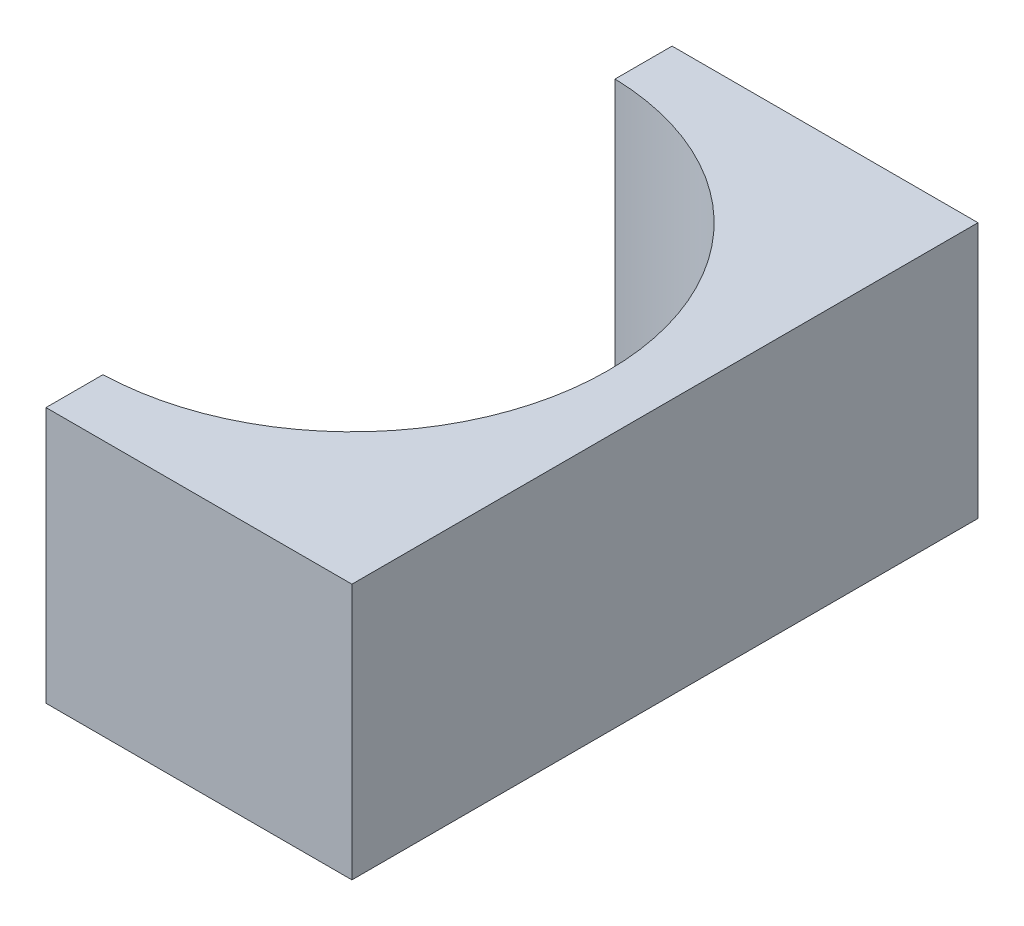
ISO-10303-21;
HEADER;
FILE_DESCRIPTION(('STEP AP214'),'2;1');
FILE_NAME('part.step','',(''),(''),'','','');
FILE_SCHEMA(('AUTOMOTIVE_DESIGN { 1 0 10303 214 1 1 1 1 }'));
ENDSEC;
DATA;
#1=APPLICATION_CONTEXT('core data for automotive mechanical design processes');
#2=APPLICATION_PROTOCOL_DEFINITION('international standard','automotive_design',2000,#1);
#3=PRODUCT_CONTEXT('',#1,'mechanical');
#4=PRODUCT('Part','Part','',(#3));
#5=PRODUCT_RELATED_PRODUCT_CATEGORY('part','',(#4));
#6=PRODUCT_DEFINITION_FORMATION('','',#4);
#7=PRODUCT_DEFINITION_CONTEXT('part definition',#1,'design');
#8=PRODUCT_DEFINITION('design','',#6,#7);
#9=PRODUCT_DEFINITION_SHAPE('','',#8);
#10=(LENGTH_UNIT() NAMED_UNIT(*) SI_UNIT(.MILLI.,.METRE.));
#11=(NAMED_UNIT(*) PLANE_ANGLE_UNIT() SI_UNIT($,.RADIAN.));
#12=(NAMED_UNIT(*) SI_UNIT($,.STERADIAN.) SOLID_ANGLE_UNIT());
#13=UNCERTAINTY_MEASURE_WITH_UNIT(LENGTH_MEASURE(1.E-05),#10,'distance_accuracy_value','');
#14=(GEOMETRIC_REPRESENTATION_CONTEXT(3) GLOBAL_UNCERTAINTY_ASSIGNED_CONTEXT((#13)) GLOBAL_UNIT_ASSIGNED_CONTEXT((#10,
#11,#12)) REPRESENTATION_CONTEXT('',''));
#15=CARTESIAN_POINT('',(0.,0.,0.));
#16=DIRECTION('',(0.,0.,1.));
#17=DIRECTION('',(1.,0.,0.));
#18=AXIS2_PLACEMENT_3D('',#15,#16,#17);
#19=CARTESIAN_POINT('',(0.,22.86,0.));
#20=DIRECTION('',(1.,0.,0.));
#21=DIRECTION('',(0.,0.,-1.));
#22=AXIS2_PLACEMENT_3D('',#19,#20,#21);
#23=PLANE('',#22);
#24=DIRECTION('',(0.,0.,1.));
#25=VECTOR('',#24,1.);
#26=CARTESIAN_POINT('',(0.,0.,0.));
#27=LINE('',#26,#25);
#28=CARTESIAN_POINT('',(0.,0.,-5.08882114638284));
#29=VERTEX_POINT('',#28);
#30=CARTESIAN_POINT('',(0.,0.,0.));
#31=VERTEX_POINT('',#30);
#32=EDGE_CURVE('E117',#29,#31,#27,.T.);
#33=ORIENTED_EDGE('',*,*,#32,.T.);
#34=DIRECTION('',(0.,-1.,0.));
#35=VECTOR('',#34,1.);
#36=CARTESIAN_POINT('',(0.,22.86,0.));
#37=LINE('',#36,#35);
#38=CARTESIAN_POINT('',(0.,22.86,0.));
#39=VERTEX_POINT('',#38);
#40=EDGE_CURVE('E11',#39,#31,#37,.T.);
#41=ORIENTED_EDGE('',*,*,#40,.F.);
#42=DIRECTION('',(0.,0.,1.));
#43=VECTOR('',#42,1.);
#44=CARTESIAN_POINT('',(0.,22.86,0.));
#45=LINE('',#44,#43);
#46=CARTESIAN_POINT('',(0.,22.86,-5.08882114638284));
#47=VERTEX_POINT('',#46);
#48=EDGE_CURVE('E127',#47,#39,#45,.T.);
#49=ORIENTED_EDGE('',*,*,#48,.F.);
#50=DIRECTION('',(0.,-1.,0.));
#51=VECTOR('',#50,1.);
#52=CARTESIAN_POINT('',(0.,22.86,-5.08882114638284));
#53=LINE('',#52,#51);
#54=EDGE_CURVE('E113',#47,#29,#53,.T.);
#55=ORIENTED_EDGE('',*,*,#54,.T.);
#56=EDGE_LOOP('',(#33,#41,#49,#55));
#57=FACE_BOUND('',#56,.T.);
#58=ADVANCED_FACE('F33',(#57),#23,.F.);
#59=CARTESIAN_POINT('',(0.,22.86,0.));
#60=DIRECTION('',(0.,0.,-1.));
#61=DIRECTION('',(-1.,0.,0.));
#62=AXIS2_PLACEMENT_3D('',#59,#60,#61);
#63=PLANE('',#62);
#64=DIRECTION('',(1.,0.,0.));
#65=VECTOR('',#64,1.);
#66=CARTESIAN_POINT('',(0.,0.,0.));
#67=LINE('',#66,#65);
#68=CARTESIAN_POINT('',(27.305,0.,0.));
#69=VERTEX_POINT('',#68);
#70=EDGE_CURVE('E120',#31,#69,#67,.T.);
#71=ORIENTED_EDGE('',*,*,#70,.T.);
#72=DIRECTION('',(0.,-1.,0.));
#73=VECTOR('',#72,1.);
#74=CARTESIAN_POINT('',(27.305,22.86,0.));
#75=LINE('',#74,#73);
#76=CARTESIAN_POINT('',(27.305,22.86,0.));
#77=VERTEX_POINT('',#76);
#78=EDGE_CURVE('E41',#77,#69,#75,.T.);
#79=ORIENTED_EDGE('',*,*,#78,.F.);
#80=DIRECTION('',(1.,0.,0.));
#81=VECTOR('',#80,1.);
#82=CARTESIAN_POINT('',(0.,22.86,0.));
#83=LINE('',#82,#81);
#84=EDGE_CURVE('E86',#39,#77,#83,.T.);
#85=ORIENTED_EDGE('',*,*,#84,.F.);
#86=ORIENTED_EDGE('',*,*,#40,.T.);
#87=EDGE_LOOP('',(#71,#79,#85,#86));
#88=FACE_BOUND('',#87,.T.);
#89=ADVANCED_FACE('F151',(#88),#63,.F.);
#90=CARTESIAN_POINT('',(27.305,22.86,0.));
#91=DIRECTION('',(-1.,0.,0.));
#92=DIRECTION('',(0.,0.,1.));
#93=AXIS2_PLACEMENT_3D('',#90,#91,#92);
#94=PLANE('',#93);
#95=DIRECTION('',(0.,0.,-1.));
#96=VECTOR('',#95,1.);
#97=CARTESIAN_POINT('',(27.305,0.,0.));
#98=LINE('',#97,#96);
#99=CARTESIAN_POINT('',(27.305,0.,-55.88));
#100=VERTEX_POINT('',#99);
#101=EDGE_CURVE('E122',#69,#100,#98,.T.);
#102=ORIENTED_EDGE('',*,*,#101,.T.);
#103=DIRECTION('',(0.,-1.,0.));
#104=VECTOR('',#103,1.);
#105=CARTESIAN_POINT('',(27.305,22.86,-55.88));
#106=LINE('',#105,#104);
#107=CARTESIAN_POINT('',(27.305,22.86,-55.88));
#108=VERTEX_POINT('',#107);
#109=EDGE_CURVE('E108',#108,#100,#106,.T.);
#110=ORIENTED_EDGE('',*,*,#109,.F.);
#111=DIRECTION('',(0.,0.,-1.));
#112=VECTOR('',#111,1.);
#113=CARTESIAN_POINT('',(27.305,22.86,0.));
#114=LINE('',#113,#112);
#115=EDGE_CURVE('E99',#77,#108,#114,.T.);
#116=ORIENTED_EDGE('',*,*,#115,.F.);
#117=ORIENTED_EDGE('',*,*,#78,.T.);
#118=EDGE_LOOP('',(#102,#110,#116,#117));
#119=FACE_BOUND('',#118,.T.);
#120=ADVANCED_FACE('F133',(#119),#94,.F.);
#121=CARTESIAN_POINT('',(0.,22.86,-55.88));
#122=DIRECTION('',(0.,0.,1.));
#123=DIRECTION('',(1.,0.,0.));
#124=AXIS2_PLACEMENT_3D('',#121,#122,#123);
#125=PLANE('',#124);
#126=DIRECTION('',(-1.,0.,0.));
#127=VECTOR('',#126,1.);
#128=CARTESIAN_POINT('',(0.,0.,-55.88));
#129=LINE('',#128,#127);
#130=CARTESIAN_POINT('',(0.,0.,-55.88));
#131=VERTEX_POINT('',#130);
#132=EDGE_CURVE('E107',#100,#131,#129,.T.);
#133=ORIENTED_EDGE('',*,*,#132,.T.);
#134=DIRECTION('',(0.,-1.,0.));
#135=VECTOR('',#134,1.);
#136=CARTESIAN_POINT('',(0.,22.86,-55.88));
#137=LINE('',#136,#135);
#138=CARTESIAN_POINT('',(0.,22.86,-55.88));
#139=VERTEX_POINT('',#138);
#140=EDGE_CURVE('E104',#139,#131,#137,.T.);
#141=ORIENTED_EDGE('',*,*,#140,.F.);
#142=DIRECTION('',(-1.,0.,0.));
#143=VECTOR('',#142,1.);
#144=CARTESIAN_POINT('',(0.,22.86,-55.88));
#145=LINE('',#144,#143);
#146=EDGE_CURVE('E93',#108,#139,#145,.T.);
#147=ORIENTED_EDGE('',*,*,#146,.F.);
#148=ORIENTED_EDGE('',*,*,#109,.T.);
#149=EDGE_LOOP('',(#133,#141,#147,#148));
#150=FACE_BOUND('',#149,.T.);
#151=ADVANCED_FACE('F105',(#150),#125,.F.);
#152=CARTESIAN_POINT('',(0.,22.86,-55.88));
#153=DIRECTION('',(1.,0.,0.));
#154=DIRECTION('',(0.,0.,-1.));
#155=AXIS2_PLACEMENT_3D('',#152,#153,#154);
#156=PLANE('',#155);
#157=DIRECTION('',(0.,0.,1.));
#158=VECTOR('',#157,1.);
#159=CARTESIAN_POINT('',(0.,0.,-55.88));
#160=LINE('',#159,#158);
#161=CARTESIAN_POINT('',(0.,0.,-50.7911788536172));
#162=VERTEX_POINT('',#161);
#163=EDGE_CURVE('E72',#131,#162,#160,.T.);
#164=ORIENTED_EDGE('',*,*,#163,.T.);
#165=DIRECTION('',(0.,-1.,0.));
#166=VECTOR('',#165,1.);
#167=CARTESIAN_POINT('',(0.,22.86,-50.7911788536172));
#168=LINE('',#167,#166);
#169=CARTESIAN_POINT('',(0.,22.86,-50.7911788536172));
#170=VERTEX_POINT('',#169);
#171=EDGE_CURVE('E109',#170,#162,#168,.T.);
#172=ORIENTED_EDGE('',*,*,#171,.F.);
#173=DIRECTION('',(0.,0.,1.));
#174=VECTOR('',#173,1.);
#175=CARTESIAN_POINT('',(0.,22.86,-55.88));
#176=LINE('',#175,#174);
#177=EDGE_CURVE('E97',#139,#170,#176,.T.);
#178=ORIENTED_EDGE('',*,*,#177,.F.);
#179=ORIENTED_EDGE('',*,*,#140,.T.);
#180=EDGE_LOOP('',(#164,#172,#178,#179));
#181=FACE_BOUND('',#180,.T.);
#182=ADVANCED_FACE('F111',(#181),#156,.F.);
#183=CARTESIAN_POINT('',(-0.635,22.86,-27.94));
#184=DIRECTION('',(0.,-1.,0.));
#185=DIRECTION('',(0.,0.,-1.));
#186=AXIS2_PLACEMENT_3D('',#183,#184,#185);
#187=CYLINDRICAL_SURFACE('',#186,22.86);
#188=CARTESIAN_POINT('',(-0.635,0.,-27.94));
#189=DIRECTION('',(0.,-1.,0.));
#190=DIRECTION('',(0.,0.,-1.));
#191=AXIS2_PLACEMENT_3D('',#188,#189,#190);
#192=CIRCLE('',#191,22.86);
#193=EDGE_CURVE('E78',#162,#29,#192,.T.);
#194=ORIENTED_EDGE('',*,*,#193,.T.);
#195=ORIENTED_EDGE('',*,*,#54,.F.);
#196=CARTESIAN_POINT('',(-0.635,22.86,-27.94));
#197=DIRECTION('',(0.,-1.,0.));
#198=DIRECTION('',(0.,0.,-1.));
#199=AXIS2_PLACEMENT_3D('',#196,#197,#198);
#200=CIRCLE('',#199,22.86);
#201=EDGE_CURVE('E49',#170,#47,#200,.T.);
#202=ORIENTED_EDGE('',*,*,#201,.F.);
#203=ORIENTED_EDGE('',*,*,#171,.T.);
#204=EDGE_LOOP('',(#194,#195,#202,#203));
#205=FACE_BOUND('',#204,.T.);
#206=ADVANCED_FACE('F140',(#205),#187,.F.);
#207=CARTESIAN_POINT('',(-0.635,22.86,-27.94));
#208=DIRECTION('',(0.,-1.,0.));
#209=DIRECTION('',(0.,0.,-1.));
#210=AXIS2_PLACEMENT_3D('',#207,#208,#209);
#211=PLANE('',#210);
#212=ORIENTED_EDGE('',*,*,#48,.T.);
#213=ORIENTED_EDGE('',*,*,#84,.T.);
#214=ORIENTED_EDGE('',*,*,#115,.T.);
#215=ORIENTED_EDGE('',*,*,#146,.T.);
#216=ORIENTED_EDGE('',*,*,#177,.T.);
#217=ORIENTED_EDGE('',*,*,#201,.T.);
#218=EDGE_LOOP('',(#212,#213,#214,#215,#216,#217));
#219=FACE_BOUND('',#218,.T.);
#220=ADVANCED_FACE('F95',(#219),#211,.F.);
#221=CARTESIAN_POINT('',(-0.635,0.,-27.94));
#222=DIRECTION('',(0.,-1.,0.));
#223=DIRECTION('',(0.,0.,-1.));
#224=AXIS2_PLACEMENT_3D('',#221,#222,#223);
#225=PLANE('',#224);
#226=ORIENTED_EDGE('',*,*,#32,.F.);
#227=ORIENTED_EDGE('',*,*,#193,.F.);
#228=ORIENTED_EDGE('',*,*,#163,.F.);
#229=ORIENTED_EDGE('',*,*,#132,.F.);
#230=ORIENTED_EDGE('',*,*,#101,.F.);
#231=ORIENTED_EDGE('',*,*,#70,.F.);
#232=EDGE_LOOP('',(#226,#227,#228,#229,#230,#231));
#233=FACE_BOUND('',#232,.T.);
#234=ADVANCED_FACE('F136',(#233),#225,.T.);
#235=CLOSED_SHELL('',(#58,#89,#120,#151,#182,#206,#220,#234));
#236=MANIFOLD_SOLID_BREP('B2',#235);
#237=ADVANCED_BREP_SHAPE_REPRESENTATION('',(#18,#236),#14);
#238=SHAPE_DEFINITION_REPRESENTATION(#9,#237);
ENDSEC;
END-ISO-10303-21;
